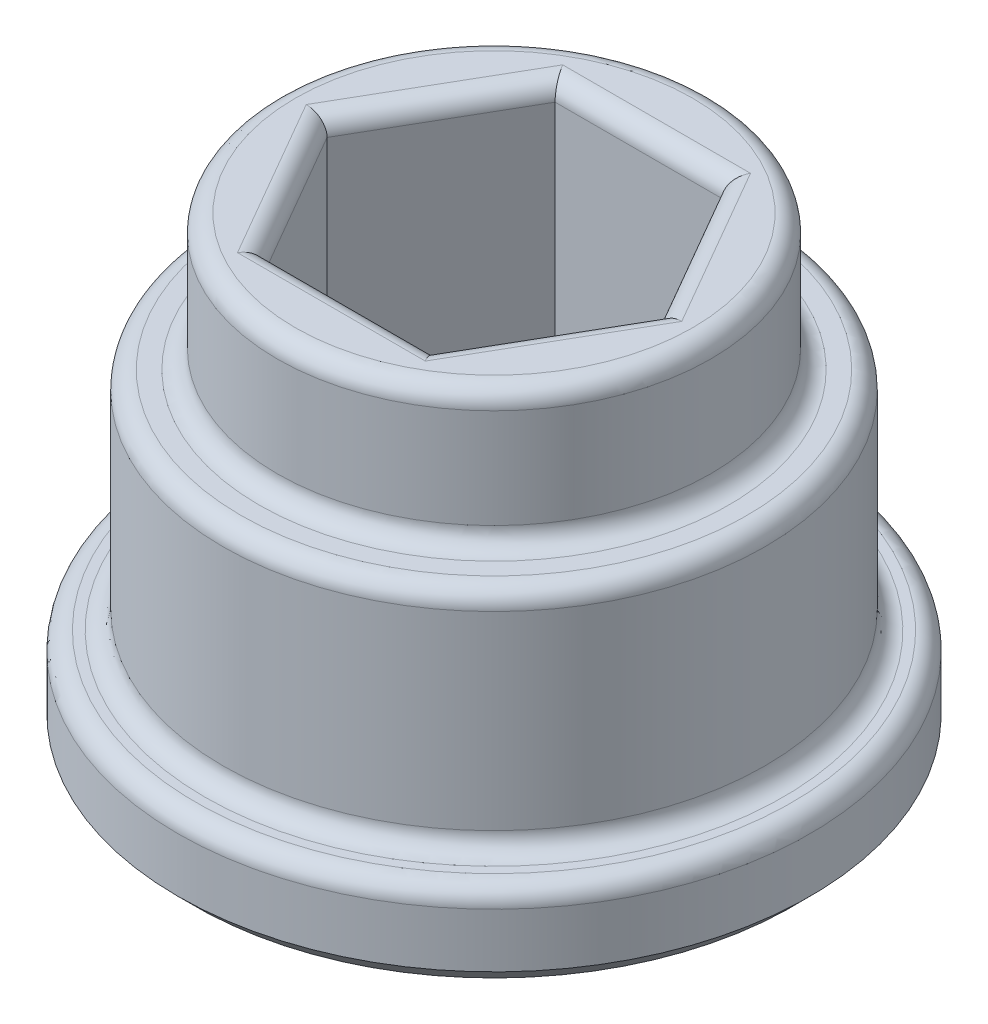
ISO-10303-21;
HEADER;
FILE_DESCRIPTION(('STEP AP214'),'2;1');
FILE_NAME('part.step','',(''),(''),'','','');
FILE_SCHEMA(('AUTOMOTIVE_DESIGN { 1 0 10303 214 1 1 1 1 }'));
ENDSEC;
DATA;
#1=APPLICATION_CONTEXT('core data for automotive mechanical design processes');
#2=APPLICATION_PROTOCOL_DEFINITION('international standard','automotive_design',2000,#1);
#3=PRODUCT_CONTEXT('',#1,'mechanical');
#4=PRODUCT('Part','Part','',(#3));
#5=PRODUCT_RELATED_PRODUCT_CATEGORY('part','',(#4));
#6=PRODUCT_DEFINITION_FORMATION('','',#4);
#7=PRODUCT_DEFINITION_CONTEXT('part definition',#1,'design');
#8=PRODUCT_DEFINITION('design','',#6,#7);
#9=PRODUCT_DEFINITION_SHAPE('','',#8);
#10=(LENGTH_UNIT() NAMED_UNIT(*) SI_UNIT(.MILLI.,.METRE.));
#11=(NAMED_UNIT(*) PLANE_ANGLE_UNIT() SI_UNIT($,.RADIAN.));
#12=(NAMED_UNIT(*) SI_UNIT($,.STERADIAN.) SOLID_ANGLE_UNIT());
#13=UNCERTAINTY_MEASURE_WITH_UNIT(LENGTH_MEASURE(1.E-05),#10,'distance_accuracy_value','');
#14=(GEOMETRIC_REPRESENTATION_CONTEXT(3) GLOBAL_UNCERTAINTY_ASSIGNED_CONTEXT((#13)) GLOBAL_UNIT_ASSIGNED_CONTEXT((#10,
#11,#12)) REPRESENTATION_CONTEXT('',''));
#15=CARTESIAN_POINT('',(0.,0.,0.));
#16=DIRECTION('',(0.,0.,1.));
#17=DIRECTION('',(1.,0.,0.));
#18=AXIS2_PLACEMENT_3D('',#15,#16,#17);
#19=CARTESIAN_POINT('',(0.,7.9375,0.));
#20=DIRECTION('',(0.,1.,0.));
#21=DIRECTION('',(0.,0.,1.));
#22=AXIS2_PLACEMENT_3D('',#19,#20,#21);
#23=PLANE('',#22);
#24=CARTESIAN_POINT('',(0.,7.9375,0.));
#25=DIRECTION('',(0.,1.,0.));
#26=DIRECTION('',(0.,0.,1.));
#27=AXIS2_PLACEMENT_3D('',#24,#25,#26);
#28=CIRCLE('',#27,8.255);
#29=CARTESIAN_POINT('',(0.,7.9375,8.255));
#30=VERTEX_POINT('',#29);
#31=EDGE_CURVE('E275',#30,#30,#28,.F.);
#32=ORIENTED_EDGE('',*,*,#31,.T.);
#33=EDGE_LOOP('',(#32));
#34=FACE_BOUND('',#33,.T.);
#35=CARTESIAN_POINT('',(0.,7.9375,0.));
#36=DIRECTION('',(0.,1.,0.));
#37=DIRECTION('',(0.,0.,1.));
#38=AXIS2_PLACEMENT_3D('',#35,#36,#37);
#39=CIRCLE('',#38,8.89);
#40=CARTESIAN_POINT('',(0.,7.9375,8.89));
#41=VERTEX_POINT('',#40);
#42=EDGE_CURVE('E271',#41,#41,#39,.T.);
#43=ORIENTED_EDGE('',*,*,#42,.T.);
#44=EDGE_LOOP('',(#43));
#45=FACE_BOUND('',#44,.T.);
#46=ADVANCED_FACE('F51',(#34,#45),#23,.T.);
#47=CARTESIAN_POINT('',(0.,7.9375,0.));
#48=DIRECTION('',(0.,-1.,0.));
#49=DIRECTION('',(0.,0.,-1.));
#50=AXIS2_PLACEMENT_3D('',#47,#48,#49);
#51=CYLINDRICAL_SURFACE('',#50,9.525);
#52=CARTESIAN_POINT('',(0.,7.3025,0.));
#53=DIRECTION('',(0.,1.,0.));
#54=DIRECTION('',(0.,0.,1.));
#55=AXIS2_PLACEMENT_3D('',#52,#53,#54);
#56=CIRCLE('',#55,9.525);
#57=CARTESIAN_POINT('',(0.,7.3025,9.525));
#58=VERTEX_POINT('',#57);
#59=EDGE_CURVE('E283',#58,#58,#56,.F.);
#60=ORIENTED_EDGE('',*,*,#59,.T.);
#61=EDGE_LOOP('',(#60));
#62=FACE_BOUND('',#61,.T.);
#63=CARTESIAN_POINT('',(0.,0.635,0.));
#64=DIRECTION('',(0.,-1.,0.));
#65=DIRECTION('',(0.,0.,-1.));
#66=AXIS2_PLACEMENT_3D('',#63,#64,#65);
#67=CIRCLE('',#66,9.525);
#68=CARTESIAN_POINT('',(0.,0.635,-9.525));
#69=VERTEX_POINT('',#68);
#70=EDGE_CURVE('E206',#69,#69,#67,.F.);
#71=ORIENTED_EDGE('',*,*,#70,.T.);
#72=EDGE_LOOP('',(#71));
#73=FACE_BOUND('',#72,.T.);
#74=ADVANCED_FACE('F401',(#62,#73),#51,.T.);
#75=CARTESIAN_POINT('',(2.9329393674833,7.9375,5.08));
#76=DIRECTION('',(-0.866025403784439,0.,-0.5));
#77=DIRECTION('',(-0.5,0.,0.866025403784439));
#78=AXIS2_PLACEMENT_3D('',#75,#76,#77);
#79=PLANE('',#78);
#80=DIRECTION('',(0.,-1.,0.));
#81=VECTOR('',#80,1.);
#82=CARTESIAN_POINT('',(5.8658787349666,7.9375,0.));
#83=LINE('',#82,#81);
#84=CARTESIAN_POINT('',(5.8658787349666,12.065,0.));
#85=VERTEX_POINT('',#84);
#86=CARTESIAN_POINT('',(5.8658787349666,-2.54,0.));
#87=VERTEX_POINT('',#86);
#88=EDGE_CURVE('E202',#85,#87,#83,.T.);
#89=ORIENTED_EDGE('',*,*,#88,.T.);
#90=DIRECTION('',(-0.5,0.,0.866025403784439));
#91=VECTOR('',#90,1.);
#92=CARTESIAN_POINT('',(2.9329393674833,-2.54,5.08));
#93=LINE('',#92,#91);
#94=CARTESIAN_POINT('',(2.9329393674833,-2.54,5.08));
#95=VERTEX_POINT('',#94);
#96=EDGE_CURVE('E313',#87,#95,#93,.T.);
#97=ORIENTED_EDGE('',*,*,#96,.T.);
#98=DIRECTION('',(0.,-1.,0.));
#99=VECTOR('',#98,1.);
#100=CARTESIAN_POINT('',(2.9329393674833,7.9375,5.08));
#101=LINE('',#100,#99);
#102=CARTESIAN_POINT('',(2.9329393674833,12.065,5.08));
#103=VERTEX_POINT('',#102);
#104=EDGE_CURVE('E184',#103,#95,#101,.T.);
#105=ORIENTED_EDGE('',*,*,#104,.F.);
#106=DIRECTION('',(0.5,0.,-0.866025403784439));
#107=VECTOR('',#106,1.);
#108=CARTESIAN_POINT('',(2.9329393674833,12.065,5.08));
#109=LINE('',#108,#107);
#110=EDGE_CURVE('E170',#103,#85,#109,.T.);
#111=ORIENTED_EDGE('',*,*,#110,.T.);
#112=EDGE_LOOP('',(#89,#97,#105,#111));
#113=FACE_BOUND('',#112,.T.);
#114=ADVANCED_FACE('F406',(#113),#79,.T.);
#115=CARTESIAN_POINT('',(5.8658787349666,7.9375,0.));
#116=DIRECTION('',(-0.866025403784438,0.,0.5));
#117=DIRECTION('',(0.5,0.,0.866025403784438));
#118=AXIS2_PLACEMENT_3D('',#115,#116,#117);
#119=PLANE('',#118);
#120=DIRECTION('',(0.,-1.,0.));
#121=VECTOR('',#120,1.);
#122=CARTESIAN_POINT('',(2.9329393674833,7.9375,-5.08));
#123=LINE('',#122,#121);
#124=CARTESIAN_POINT('',(2.9329393674833,12.065,-5.08));
#125=VERTEX_POINT('',#124);
#126=CARTESIAN_POINT('',(2.9329393674833,-2.54,-5.08));
#127=VERTEX_POINT('',#126);
#128=EDGE_CURVE('E198',#125,#127,#123,.T.);
#129=ORIENTED_EDGE('',*,*,#128,.T.);
#130=DIRECTION('',(0.5,0.,0.866025403784438));
#131=VECTOR('',#130,1.);
#132=CARTESIAN_POINT('',(5.8658787349666,-2.54,0.));
#133=LINE('',#132,#131);
#134=EDGE_CURVE('E287',#127,#87,#133,.T.);
#135=ORIENTED_EDGE('',*,*,#134,.T.);
#136=ORIENTED_EDGE('',*,*,#88,.F.);
#137=DIRECTION('',(-0.5,0.,-0.866025403784438));
#138=VECTOR('',#137,1.);
#139=CARTESIAN_POINT('',(5.8658787349666,12.065,0.));
#140=LINE('',#139,#138);
#141=EDGE_CURVE('E239',#85,#125,#140,.T.);
#142=ORIENTED_EDGE('',*,*,#141,.T.);
#143=EDGE_LOOP('',(#129,#135,#136,#142));
#144=FACE_BOUND('',#143,.T.);
#145=ADVANCED_FACE('F370',(#144),#119,.T.);
#146=CARTESIAN_POINT('',(2.9329393674833,7.9375,-5.08));
#147=DIRECTION('',(0.,0.,1.));
#148=DIRECTION('',(1.,0.,0.));
#149=AXIS2_PLACEMENT_3D('',#146,#147,#148);
#150=PLANE('',#149);
#151=DIRECTION('',(0.,-1.,0.));
#152=VECTOR('',#151,1.);
#153=CARTESIAN_POINT('',(-2.9329393674833,7.9375,-5.08));
#154=LINE('',#153,#152);
#155=CARTESIAN_POINT('',(-2.9329393674833,12.065,-5.08));
#156=VERTEX_POINT('',#155);
#157=CARTESIAN_POINT('',(-2.9329393674833,-2.54,-5.08));
#158=VERTEX_POINT('',#157);
#159=EDGE_CURVE('E190',#156,#158,#154,.T.);
#160=ORIENTED_EDGE('',*,*,#159,.T.);
#161=DIRECTION('',(1.,0.,0.));
#162=VECTOR('',#161,1.);
#163=CARTESIAN_POINT('',(2.9329393674833,-2.54,-5.08));
#164=LINE('',#163,#162);
#165=EDGE_CURVE('E62',#158,#127,#164,.T.);
#166=ORIENTED_EDGE('',*,*,#165,.T.);
#167=ORIENTED_EDGE('',*,*,#128,.F.);
#168=DIRECTION('',(-1.,0.,0.));
#169=VECTOR('',#168,1.);
#170=CARTESIAN_POINT('',(2.9329393674833,12.065,-5.08));
#171=LINE('',#170,#169);
#172=EDGE_CURVE('E242',#125,#156,#171,.T.);
#173=ORIENTED_EDGE('',*,*,#172,.T.);
#174=EDGE_LOOP('',(#160,#166,#167,#173));
#175=FACE_BOUND('',#174,.T.);
#176=ADVANCED_FACE('F367',(#175),#150,.T.);
#177=CARTESIAN_POINT('',(-2.9329393674833,7.9375,-5.08));
#178=DIRECTION('',(0.866025403784438,0.,0.5));
#179=DIRECTION('',(0.5,0.,-0.866025403784439));
#180=AXIS2_PLACEMENT_3D('',#177,#178,#179);
#181=PLANE('',#180);
#182=DIRECTION('',(0.,-1.,0.));
#183=VECTOR('',#182,1.);
#184=CARTESIAN_POINT('',(-5.8658787349666,7.9375,0.));
#185=LINE('',#184,#183);
#186=CARTESIAN_POINT('',(-5.8658787349666,12.065,0.));
#187=VERTEX_POINT('',#186);
#188=CARTESIAN_POINT('',(-5.8658787349666,-2.54,0.));
#189=VERTEX_POINT('',#188);
#190=EDGE_CURVE('E174',#187,#189,#185,.T.);
#191=ORIENTED_EDGE('',*,*,#190,.T.);
#192=DIRECTION('',(0.5,0.,-0.866025403784439));
#193=VECTOR('',#192,1.);
#194=CARTESIAN_POINT('',(-2.9329393674833,-2.54,-5.08));
#195=LINE('',#194,#193);
#196=EDGE_CURVE('E70',#189,#158,#195,.T.);
#197=ORIENTED_EDGE('',*,*,#196,.T.);
#198=ORIENTED_EDGE('',*,*,#159,.F.);
#199=DIRECTION('',(-0.5,0.,0.866025403784439));
#200=VECTOR('',#199,1.);
#201=CARTESIAN_POINT('',(-2.9329393674833,12.065,-5.08));
#202=LINE('',#201,#200);
#203=EDGE_CURVE('E245',#156,#187,#202,.T.);
#204=ORIENTED_EDGE('',*,*,#203,.T.);
#205=EDGE_LOOP('',(#191,#197,#198,#204));
#206=FACE_BOUND('',#205,.T.);
#207=ADVANCED_FACE('F389',(#206),#181,.T.);
#208=CARTESIAN_POINT('',(-5.8658787349666,7.9375,0.));
#209=DIRECTION('',(0.866025403784438,0.,-0.5));
#210=DIRECTION('',(-0.5,0.,-0.866025403784439));
#211=AXIS2_PLACEMENT_3D('',#208,#209,#210);
#212=PLANE('',#211);
#213=DIRECTION('',(0.,-1.,0.));
#214=VECTOR('',#213,1.);
#215=CARTESIAN_POINT('',(-2.9329393674833,7.9375,5.08));
#216=LINE('',#215,#214);
#217=CARTESIAN_POINT('',(-2.9329393674833,12.065,5.08));
#218=VERTEX_POINT('',#217);
#219=CARTESIAN_POINT('',(-2.9329393674833,-2.54,5.08));
#220=VERTEX_POINT('',#219);
#221=EDGE_CURVE('E173',#218,#220,#216,.T.);
#222=ORIENTED_EDGE('',*,*,#221,.T.);
#223=DIRECTION('',(-0.5,0.,-0.866025403784439));
#224=VECTOR('',#223,1.);
#225=CARTESIAN_POINT('',(-5.8658787349666,-2.54,0.));
#226=LINE('',#225,#224);
#227=EDGE_CURVE('E78',#220,#189,#226,.T.);
#228=ORIENTED_EDGE('',*,*,#227,.T.);
#229=ORIENTED_EDGE('',*,*,#190,.F.);
#230=DIRECTION('',(0.5,0.,0.866025403784439));
#231=VECTOR('',#230,1.);
#232=CARTESIAN_POINT('',(-5.8658787349666,12.065,0.));
#233=LINE('',#232,#231);
#234=EDGE_CURVE('E152',#187,#218,#233,.T.);
#235=ORIENTED_EDGE('',*,*,#234,.T.);
#236=EDGE_LOOP('',(#222,#228,#229,#235));
#237=FACE_BOUND('',#236,.T.);
#238=ADVANCED_FACE('F172',(#237),#212,.T.);
#239=CARTESIAN_POINT('',(-2.9329393674833,7.9375,5.08));
#240=DIRECTION('',(0.,0.,-1.));
#241=DIRECTION('',(-1.,0.,0.));
#242=AXIS2_PLACEMENT_3D('',#239,#240,#241);
#243=PLANE('',#242);
#244=ORIENTED_EDGE('',*,*,#104,.T.);
#245=DIRECTION('',(-1.,0.,0.));
#246=VECTOR('',#245,1.);
#247=CARTESIAN_POINT('',(-2.9329393674833,-2.54,5.08));
#248=LINE('',#247,#246);
#249=EDGE_CURVE('E182',#95,#220,#248,.T.);
#250=ORIENTED_EDGE('',*,*,#249,.T.);
#251=ORIENTED_EDGE('',*,*,#221,.F.);
#252=DIRECTION('',(1.,0.,0.));
#253=VECTOR('',#252,1.);
#254=CARTESIAN_POINT('',(-2.9329393674833,12.065,5.08));
#255=LINE('',#254,#253);
#256=EDGE_CURVE('E161',#218,#103,#255,.T.);
#257=ORIENTED_EDGE('',*,*,#256,.T.);
#258=EDGE_LOOP('',(#244,#250,#251,#257));
#259=FACE_BOUND('',#258,.T.);
#260=ADVANCED_FACE('F180',(#259),#243,.T.);
#261=CARTESIAN_POINT('',(0.,12.7,0.));
#262=DIRECTION('',(0.,1.,0.));
#263=DIRECTION('',(0.,0.,1.));
#264=AXIS2_PLACEMENT_3D('',#261,#262,#263);
#265=PLANE('',#264);
#266=CARTESIAN_POINT('',(0.,12.7,0.));
#267=DIRECTION('',(0.,1.,0.));
#268=DIRECTION('',(0.,0.,1.));
#269=AXIS2_PLACEMENT_3D('',#266,#267,#268);
#270=CIRCLE('',#269,6.985);
#271=CARTESIAN_POINT('',(0.,12.7,6.985));
#272=VERTEX_POINT('',#271);
#273=EDGE_CURVE('E279',#272,#272,#270,.T.);
#274=ORIENTED_EDGE('',*,*,#273,.T.);
#275=EDGE_LOOP('',(#274));
#276=FACE_BOUND('',#275,.T.);
#277=DIRECTION('',(1.,0.,0.));
#278=VECTOR('',#277,1.);
#279=CARTESIAN_POINT('',(0.,12.7,5.715));
#280=LINE('',#279,#278);
#281=CARTESIAN_POINT('',(3.29955678841871,12.7,5.715));
#282=VERTEX_POINT('',#281);
#283=CARTESIAN_POINT('',(-3.29955678841871,12.7,5.715));
#284=VERTEX_POINT('',#283);
#285=EDGE_CURVE('E232',#282,#284,#280,.F.);
#286=ORIENTED_EDGE('',*,*,#285,.T.);
#287=DIRECTION('',(0.5,0.,0.866025403784439));
#288=VECTOR('',#287,1.);
#289=CARTESIAN_POINT('',(-4.94933518262807,12.7,2.8575));
#290=LINE('',#289,#288);
#291=CARTESIAN_POINT('',(-6.59911357683742,12.7,0.));
#292=VERTEX_POINT('',#291);
#293=EDGE_CURVE('E154',#284,#292,#290,.F.);
#294=ORIENTED_EDGE('',*,*,#293,.T.);
#295=DIRECTION('',(-0.5,0.,0.866025403784439));
#296=VECTOR('',#295,1.);
#297=CARTESIAN_POINT('',(-4.94933518262807,12.7,-2.8575));
#298=LINE('',#297,#296);
#299=CARTESIAN_POINT('',(-3.29955678841871,12.7,-5.715));
#300=VERTEX_POINT('',#299);
#301=EDGE_CURVE('E177',#292,#300,#298,.F.);
#302=ORIENTED_EDGE('',*,*,#301,.T.);
#303=DIRECTION('',(-1.,0.,0.));
#304=VECTOR('',#303,1.);
#305=CARTESIAN_POINT('',(0.,12.7,-5.715));
#306=LINE('',#305,#304);
#307=CARTESIAN_POINT('',(3.29955678841871,12.7,-5.715));
#308=VERTEX_POINT('',#307);
#309=EDGE_CURVE('E223',#300,#308,#306,.F.);
#310=ORIENTED_EDGE('',*,*,#309,.T.);
#311=DIRECTION('',(-0.5,0.,-0.866025403784438));
#312=VECTOR('',#311,1.);
#313=CARTESIAN_POINT('',(4.94933518262807,12.7,-2.8575));
#314=LINE('',#313,#312);
#315=CARTESIAN_POINT('',(6.59911357683742,12.7,0.));
#316=VERTEX_POINT('',#315);
#317=EDGE_CURVE('E226',#308,#316,#314,.F.);
#318=ORIENTED_EDGE('',*,*,#317,.T.);
#319=DIRECTION('',(0.5,0.,-0.866025403784439));
#320=VECTOR('',#319,1.);
#321=CARTESIAN_POINT('',(4.94933518262807,12.7,2.8575));
#322=LINE('',#321,#320);
#323=EDGE_CURVE('E229',#316,#282,#322,.F.);
#324=ORIENTED_EDGE('',*,*,#323,.T.);
#325=EDGE_LOOP('',(#286,#294,#302,#310,#318,#324));
#326=FACE_BOUND('',#325,.T.);
#327=ADVANCED_FACE('F383',(#276,#326),#265,.T.);
#328=CARTESIAN_POINT('',(0.,12.7,0.));
#329=DIRECTION('',(0.,-1.,0.));
#330=DIRECTION('',(0.,0.,-1.));
#331=AXIS2_PLACEMENT_3D('',#328,#329,#330);
#332=CYLINDRICAL_SURFACE('',#331,7.62);
#333=CARTESIAN_POINT('',(0.,8.5725,0.));
#334=DIRECTION('',(0.,1.,0.));
#335=DIRECTION('',(0.,0.,1.));
#336=AXIS2_PLACEMENT_3D('',#333,#334,#335);
#337=CIRCLE('',#336,7.62);
#338=CARTESIAN_POINT('',(0.,8.5725,-7.62));
#339=VERTEX_POINT('',#338);
#340=EDGE_CURVE('E267',#339,#339,#337,.T.);
#341=CARTESIAN_POINT('',(0.,12.065,0.));
#342=DIRECTION('',(0.,1.,0.));
#343=DIRECTION('',(0.,0.,1.));
#344=AXIS2_PLACEMENT_3D('',#341,#342,#343);
#345=CIRCLE('',#344,7.62);
#346=CARTESIAN_POINT('',(0.,12.065,-7.62));
#347=VERTEX_POINT('',#346);
#348=EDGE_CURVE('E247',#347,#347,#345,.F.);
#349=CARTESIAN_POINT('',(0.,8.5725,-7.62));
#350=CARTESIAN_POINT('',(0.,8.60888020833333,-7.62));
#351=CARTESIAN_POINT('',(0.,8.64526041666667,-7.62));
#352=CARTESIAN_POINT('',(0.,8.71802083333333,-7.62));
#353=CARTESIAN_POINT('',(0.,8.75440104166667,-7.62));
#354=CARTESIAN_POINT('',(0.,8.82716145833333,-7.62));
#355=CARTESIAN_POINT('',(0.,8.86354166666666,-7.62));
#356=CARTESIAN_POINT('',(0.,8.93630208333333,-7.62));
#357=CARTESIAN_POINT('',(0.,8.97268229166666,-7.62));
#358=CARTESIAN_POINT('',(0.,9.04544270833333,-7.62));
#359=CARTESIAN_POINT('',(0.,9.08182291666667,-7.62));
#360=CARTESIAN_POINT('',(0.,9.15458333333333,-7.62));
#361=CARTESIAN_POINT('',(0.,9.19096354166667,-7.62));
#362=CARTESIAN_POINT('',(0.,9.26372395833333,-7.62));
#363=CARTESIAN_POINT('',(0.,9.30010416666667,-7.62));
#364=CARTESIAN_POINT('',(0.,9.37286458333333,-7.62));
#365=CARTESIAN_POINT('',(0.,9.40924479166667,-7.62));
#366=CARTESIAN_POINT('',(0.,9.48200520833333,-7.62));
#367=CARTESIAN_POINT('',(0.,9.51838541666667,-7.62));
#368=CARTESIAN_POINT('',(0.,9.59114583333333,-7.62));
#369=CARTESIAN_POINT('',(0.,9.62752604166667,-7.62));
#370=CARTESIAN_POINT('',(0.,9.70028645833333,-7.62));
#371=CARTESIAN_POINT('',(0.,9.73666666666667,-7.62));
#372=CARTESIAN_POINT('',(0.,9.80942708333333,-7.62));
#373=CARTESIAN_POINT('',(0.,9.84580729166666,-7.62));
#374=CARTESIAN_POINT('',(0.,9.91856770833333,-7.62));
#375=CARTESIAN_POINT('',(0.,9.95494791666667,-7.62));
#376=CARTESIAN_POINT('',(0.,10.0277083333333,-7.62));
#377=CARTESIAN_POINT('',(0.,10.0640885416667,-7.62));
#378=CARTESIAN_POINT('',(0.,10.1368489583333,-7.62));
#379=CARTESIAN_POINT('',(0.,10.1732291666667,-7.62));
#380=CARTESIAN_POINT('',(0.,10.2459895833333,-7.62));
#381=CARTESIAN_POINT('',(0.,10.2823697916667,-7.62));
#382=CARTESIAN_POINT('',(0.,10.3551302083333,-7.62));
#383=CARTESIAN_POINT('',(0.,10.3915104166667,-7.62));
#384=CARTESIAN_POINT('',(0.,10.4642708333333,-7.62));
#385=CARTESIAN_POINT('',(0.,10.5006510416667,-7.62));
#386=CARTESIAN_POINT('',(0.,10.5734114583333,-7.62));
#387=CARTESIAN_POINT('',(0.,10.6097916666667,-7.62));
#388=CARTESIAN_POINT('',(0.,10.6825520833333,-7.62));
#389=CARTESIAN_POINT('',(0.,10.7189322916667,-7.62));
#390=CARTESIAN_POINT('',(0.,10.7916927083333,-7.62));
#391=CARTESIAN_POINT('',(0.,10.8280729166667,-7.62));
#392=CARTESIAN_POINT('',(0.,10.9008333333333,-7.62));
#393=CARTESIAN_POINT('',(0.,10.9372135416667,-7.62));
#394=CARTESIAN_POINT('',(0.,11.0099739583333,-7.62));
#395=CARTESIAN_POINT('',(0.,11.0463541666667,-7.62));
#396=CARTESIAN_POINT('',(0.,11.1191145833333,-7.62));
#397=CARTESIAN_POINT('',(0.,11.1554947916667,-7.62));
#398=CARTESIAN_POINT('',(0.,11.2282552083333,-7.62));
#399=CARTESIAN_POINT('',(0.,11.2646354166667,-7.62));
#400=CARTESIAN_POINT('',(0.,11.3373958333333,-7.62));
#401=CARTESIAN_POINT('',(0.,11.3737760416667,-7.62));
#402=CARTESIAN_POINT('',(0.,11.4465364583333,-7.62));
#403=CARTESIAN_POINT('',(0.,11.4829166666667,-7.62));
#404=CARTESIAN_POINT('',(0.,11.5556770833333,-7.62));
#405=CARTESIAN_POINT('',(0.,11.5920572916667,-7.62));
#406=CARTESIAN_POINT('',(0.,11.6648177083333,-7.62));
#407=CARTESIAN_POINT('',(0.,11.7011979166667,-7.62));
#408=CARTESIAN_POINT('',(0.,11.7739583333333,-7.62));
#409=CARTESIAN_POINT('',(0.,11.8103385416667,-7.62));
#410=CARTESIAN_POINT('',(0.,11.8830989583333,-7.62));
#411=CARTESIAN_POINT('',(0.,11.9194791666667,-7.62));
#412=CARTESIAN_POINT('',(0.,11.9922395833333,-7.62));
#413=CARTESIAN_POINT('',(0.,12.0286197916667,-7.62));
#414=CARTESIAN_POINT('',(0.,12.065,-7.62));
#415=B_SPLINE_CURVE_WITH_KNOTS('',3,(#349,#350,#351,#352,#353,#354,#355,#356,#357,#358,#359,
#360,#361,#362,#363,#364,#365,#366,#367,#368,#369,#370,#371,#372,#373,#374,#375,#376,#377,#378,
#379,#380,#381,#382,#383,#384,#385,#386,#387,#388,#389,#390,#391,#392,#393,#394,#395,#396,#397,
#398,#399,#400,#401,#402,#403,#404,#405,#406,#407,#408,#409,#410,#411,#412,#413,#414),
.UNSPECIFIED.,.F.,.F.,(4,2,2,2,2,2,2,2,2,2,2,2,2,2,2,2,2,2,2,2,2,2,2,2,2,2,2,2,2,2,2,2,4),(0.,
0.109140625,0.218281249999999,0.327421874999999,0.436562499999998,0.545703124999998,
0.654843749999998,0.763984374999999,0.873124999999999,0.982265624999999,1.09140625,1.200546875,
1.3096875,1.418828125,1.52796875,1.637109375,1.74625,1.855390625,1.96453125,2.073671875,
2.1828125,2.291953125,2.40109375,2.510234375,2.619375,2.728515625,2.83765625,2.946796875,
3.0559375,3.165078125,3.27421875,3.383359375,3.4925),.UNSPECIFIED.);
#416=EDGE_CURVE('BSEAM632',#339,#347,#415,.T.);
#417=ORIENTED_EDGE('',*,*,#340,.T.);
#418=ORIENTED_EDGE('',*,*,#348,.T.);
#419=ORIENTED_EDGE('',*,*,#416,.T.);
#420=ORIENTED_EDGE('',*,*,#416,.F.);
#421=EDGE_LOOP('',(#417,#419,#418,#420));
#422=FACE_BOUND('',#421,.T.);
#423=ADVANCED_FACE('F632',(#422),#332,.T.);
#424=CARTESIAN_POINT('',(0.,-3.175,0.));
#425=DIRECTION('',(0.,-1.,0.));
#426=DIRECTION('',(0.,0.,-1.));
#427=AXIS2_PLACEMENT_3D('',#424,#425,#426);
#428=PLANE('',#427);
#429=DIRECTION('',(0.5,0.,-0.866025403784439));
#430=VECTOR('',#429,1.);
#431=CARTESIAN_POINT('',(4.94933518262807,-3.175,2.8575));
#432=LINE('',#431,#430);
#433=CARTESIAN_POINT('',(3.29955678841872,-3.175,5.715));
#434=VERTEX_POINT('',#433);
#435=CARTESIAN_POINT('',(6.59911357683743,-3.175,0.));
#436=VERTEX_POINT('',#435);
#437=EDGE_CURVE('E306',#434,#436,#432,.T.);
#438=ORIENTED_EDGE('',*,*,#437,.T.);
#439=DIRECTION('',(-0.5,0.,-0.866025403784439));
#440=VECTOR('',#439,1.);
#441=CARTESIAN_POINT('',(4.94933518262807,-3.175,-2.8575));
#442=LINE('',#441,#440);
#443=CARTESIAN_POINT('',(3.29955678841871,-3.175,-5.71500000000001));
#444=VERTEX_POINT('',#443);
#445=EDGE_CURVE('E309',#436,#444,#442,.T.);
#446=ORIENTED_EDGE('',*,*,#445,.T.);
#447=DIRECTION('',(-1.,0.,0.));
#448=VECTOR('',#447,1.);
#449=CARTESIAN_POINT('',(0.,-3.175,-5.71500000000001));
#450=LINE('',#449,#448);
#451=CARTESIAN_POINT('',(-3.29955678841871,-3.175,-5.71500000000001));
#452=VERTEX_POINT('',#451);
#453=EDGE_CURVE('E295',#444,#452,#450,.T.);
#454=ORIENTED_EDGE('',*,*,#453,.T.);
#455=DIRECTION('',(-0.5,0.,0.866025403784439));
#456=VECTOR('',#455,1.);
#457=CARTESIAN_POINT('',(-4.94933518262807,-3.175,-2.8575));
#458=LINE('',#457,#456);
#459=CARTESIAN_POINT('',(-6.59911357683743,-3.175,0.));
#460=VERTEX_POINT('',#459);
#461=EDGE_CURVE('E298',#452,#460,#458,.T.);
#462=ORIENTED_EDGE('',*,*,#461,.T.);
#463=DIRECTION('',(0.5,0.,0.866025403784439));
#464=VECTOR('',#463,1.);
#465=CARTESIAN_POINT('',(-4.94933518262807,-3.175,2.8575));
#466=LINE('',#465,#464);
#467=CARTESIAN_POINT('',(-3.29955678841871,-3.175,5.715));
#468=VERTEX_POINT('',#467);
#469=EDGE_CURVE('E301',#460,#468,#466,.T.);
#470=ORIENTED_EDGE('',*,*,#469,.T.);
#471=DIRECTION('',(1.,0.,0.));
#472=VECTOR('',#471,1.);
#473=CARTESIAN_POINT('',(0.,-3.175,5.715));
#474=LINE('',#473,#472);
#475=EDGE_CURVE('E303',#468,#434,#474,.T.);
#476=ORIENTED_EDGE('',*,*,#475,.T.);
#477=EDGE_LOOP('',(#438,#446,#454,#462,#470,#476));
#478=FACE_BOUND('',#477,.T.);
#479=CARTESIAN_POINT('',(0.,-3.175,0.));
#480=DIRECTION('',(0.,-1.,0.));
#481=DIRECTION('',(0.,0.,-1.));
#482=AXIS2_PLACEMENT_3D('',#479,#480,#481);
#483=CIRCLE('',#482,10.4775);
#484=CARTESIAN_POINT('',(0.,-3.175,-10.4775));
#485=VERTEX_POINT('',#484);
#486=EDGE_CURVE('E291',#485,#485,#483,.T.);
#487=ORIENTED_EDGE('',*,*,#486,.T.);
#488=EDGE_LOOP('',(#487));
#489=FACE_BOUND('',#488,.T.);
#490=ADVANCED_FACE('F355',(#478,#489),#428,.T.);
#491=CARTESIAN_POINT('',(0.,0.,0.));
#492=DIRECTION('',(0.,-1.,0.));
#493=DIRECTION('',(0.,0.,-1.));
#494=AXIS2_PLACEMENT_3D('',#491,#492,#493);
#495=PLANE('',#494);
#496=CARTESIAN_POINT('',(0.,0.,0.));
#497=DIRECTION('',(0.,-1.,0.));
#498=DIRECTION('',(0.,0.,-1.));
#499=AXIS2_PLACEMENT_3D('',#496,#497,#498);
#500=CIRCLE('',#499,10.16);
#501=CARTESIAN_POINT('',(0.,0.,-10.16));
#502=VERTEX_POINT('',#501);
#503=EDGE_CURVE('E214',#502,#502,#500,.T.);
#504=ORIENTED_EDGE('',*,*,#503,.T.);
#505=EDGE_LOOP('',(#504));
#506=FACE_BOUND('',#505,.T.);
#507=CARTESIAN_POINT('',(0.,0.,0.));
#508=DIRECTION('',(0.,-1.,0.));
#509=DIRECTION('',(0.,0.,-1.));
#510=AXIS2_PLACEMENT_3D('',#507,#508,#509);
#511=CIRCLE('',#510,10.4775);
#512=CARTESIAN_POINT('',(0.,0.,-10.4775));
#513=VERTEX_POINT('',#512);
#514=EDGE_CURVE('E210',#513,#513,#511,.F.);
#515=ORIENTED_EDGE('',*,*,#514,.T.);
#516=EDGE_LOOP('',(#515));
#517=FACE_BOUND('',#516,.T.);
#518=ADVANCED_FACE('F612',(#506,#517),#495,.F.);
#519=CARTESIAN_POINT('',(0.,-3.175,0.));
#520=DIRECTION('',(0.,1.,0.));
#521=DIRECTION('',(0.,0.,1.));
#522=AXIS2_PLACEMENT_3D('',#519,#520,#521);
#523=CYLINDRICAL_SURFACE('',#522,11.1125);
#524=CARTESIAN_POINT('',(0.,-2.54,0.));
#525=DIRECTION('',(0.,-1.,0.));
#526=DIRECTION('',(0.,0.,-1.));
#527=AXIS2_PLACEMENT_3D('',#524,#525,#526);
#528=CIRCLE('',#527,11.1125);
#529=CARTESIAN_POINT('',(0.,-2.54,-11.1125));
#530=VERTEX_POINT('',#529);
#531=EDGE_CURVE('E11',#530,#530,#528,.F.);
#532=ORIENTED_EDGE('',*,*,#531,.T.);
#533=EDGE_LOOP('',(#532));
#534=FACE_BOUND('',#533,.T.);
#535=CARTESIAN_POINT('',(0.,-0.635,0.));
#536=DIRECTION('',(0.,-1.,0.));
#537=DIRECTION('',(0.,0.,-1.));
#538=AXIS2_PLACEMENT_3D('',#535,#536,#537);
#539=CIRCLE('',#538,11.1125);
#540=CARTESIAN_POINT('',(0.,-0.635,-11.1125));
#541=VERTEX_POINT('',#540);
#542=EDGE_CURVE('E178',#541,#541,#539,.T.);
#543=ORIENTED_EDGE('',*,*,#542,.T.);
#544=EDGE_LOOP('',(#543));
#545=FACE_BOUND('',#544,.T.);
#546=ADVANCED_FACE('F417',(#534,#545),#523,.T.);
#547=CARTESIAN_POINT('',(0.,0.635,0.));
#548=DIRECTION('',(0.,-1.,0.));
#549=DIRECTION('',(0.,0.,-1.));
#550=AXIS2_PLACEMENT_3D('',#547,#548,#549);
#551=TOROIDAL_SURFACE('',#550,10.16,0.635);
#552=ORIENTED_EDGE('',*,*,#503,.F.);
#553=EDGE_LOOP('',(#552));
#554=FACE_BOUND('',#553,.T.);
#555=ORIENTED_EDGE('',*,*,#70,.F.);
#556=EDGE_LOOP('',(#555));
#557=FACE_BOUND('',#556,.T.);
#558=ADVANCED_FACE('F413',(#554,#557),#551,.F.);
#559=CARTESIAN_POINT('',(0.,-0.635,0.));
#560=DIRECTION('',(0.,-1.,0.));
#561=DIRECTION('',(0.,0.,-1.));
#562=AXIS2_PLACEMENT_3D('',#559,#560,#561);
#563=TOROIDAL_SURFACE('',#562,10.4775,0.635);
#564=ORIENTED_EDGE('',*,*,#514,.F.);
#565=EDGE_LOOP('',(#564));
#566=FACE_BOUND('',#565,.T.);
#567=ORIENTED_EDGE('',*,*,#542,.F.);
#568=EDGE_LOOP('',(#567));
#569=FACE_BOUND('',#568,.T.);
#570=ADVANCED_FACE('F416',(#566,#569),#563,.T.);
#571=CARTESIAN_POINT('',(6.41580486636972,12.065,-0.3175));
#572=DIRECTION('',(-0.5,0.,-0.866025403784438));
#573=DIRECTION('',(-0.866025403784438,0.,0.5));
#574=AXIS2_PLACEMENT_3D('',#571,#572,#573);
#575=CYLINDRICAL_SURFACE('',#574,0.635);
#576=CARTESIAN_POINT('',(6.59911357683742,12.065,0.));
#577=DIRECTION('',(0.,0.,-1.));
#578=DIRECTION('',(1.,0.,0.));
#579=AXIS2_PLACEMENT_3D('',#576,#577,#578);
#580=ELLIPSE('',#579,0.733234841870825,0.635);
#581=EDGE_CURVE('E257',#316,#85,#580,.F.);
#582=ORIENTED_EDGE('',*,*,#581,.F.);
#583=ORIENTED_EDGE('',*,*,#317,.F.);
#584=CARTESIAN_POINT('',(3.29955678841871,12.065,-5.715));
#585=DIRECTION('',(-0.866025403784439,0.,-0.5));
#586=DIRECTION('',(0.5,0.,-0.866025403784439));
#587=AXIS2_PLACEMENT_3D('',#584,#585,#586);
#588=ELLIPSE('',#587,0.733234841870825,0.635);
#589=EDGE_CURVE('E193',#125,#308,#588,.T.);
#590=ORIENTED_EDGE('',*,*,#589,.F.);
#591=ORIENTED_EDGE('',*,*,#141,.F.);
#592=EDGE_LOOP('',(#582,#583,#590,#591));
#593=FACE_BOUND('',#592,.T.);
#594=ADVANCED_FACE('F375',(#593),#575,.T.);
#595=CARTESIAN_POINT('',(2.9329393674833,12.065,-5.715));
#596=DIRECTION('',(-1.,0.,0.));
#597=DIRECTION('',(0.,0.,1.));
#598=AXIS2_PLACEMENT_3D('',#595,#596,#597);
#599=CYLINDRICAL_SURFACE('',#598,0.635);
#600=ORIENTED_EDGE('',*,*,#589,.T.);
#601=ORIENTED_EDGE('',*,*,#309,.F.);
#602=CARTESIAN_POINT('',(-3.29955678841871,12.065,-5.715));
#603=DIRECTION('',(-0.866025403784439,0.,0.5));
#604=DIRECTION('',(-0.5,0.,-0.866025403784439));
#605=AXIS2_PLACEMENT_3D('',#602,#603,#604);
#606=ELLIPSE('',#605,0.733234841870825,0.635);
#607=EDGE_CURVE('E253',#156,#300,#606,.T.);
#608=ORIENTED_EDGE('',*,*,#607,.F.);
#609=ORIENTED_EDGE('',*,*,#172,.F.);
#610=EDGE_LOOP('',(#600,#601,#608,#609));
#611=FACE_BOUND('',#610,.T.);
#612=ADVANCED_FACE('F386',(#611),#599,.T.);
#613=CARTESIAN_POINT('',(3.48286549888642,12.065,5.3975));
#614=DIRECTION('',(0.5,0.,-0.866025403784439));
#615=DIRECTION('',(-0.866025403784439,0.,-0.5));
#616=AXIS2_PLACEMENT_3D('',#613,#614,#615);
#617=CYLINDRICAL_SURFACE('',#616,0.635);
#618=ORIENTED_EDGE('',*,*,#581,.T.);
#619=ORIENTED_EDGE('',*,*,#110,.F.);
#620=CARTESIAN_POINT('',(3.29955678841871,12.065,5.715));
#621=DIRECTION('',(0.866025403784439,0.,-0.5));
#622=DIRECTION('',(0.5,0.,0.866025403784439));
#623=AXIS2_PLACEMENT_3D('',#620,#621,#622);
#624=ELLIPSE('',#623,0.733234841870825,0.635);
#625=EDGE_CURVE('E164',#282,#103,#624,.F.);
#626=ORIENTED_EDGE('',*,*,#625,.F.);
#627=ORIENTED_EDGE('',*,*,#323,.F.);
#628=EDGE_LOOP('',(#618,#619,#626,#627));
#629=FACE_BOUND('',#628,.T.);
#630=ADVANCED_FACE('F381',(#629),#617,.T.);
#631=CARTESIAN_POINT('',(-3.48286549888642,12.065,-5.3975));
#632=DIRECTION('',(-0.5,0.,0.866025403784439));
#633=DIRECTION('',(0.866025403784438,0.,0.5));
#634=AXIS2_PLACEMENT_3D('',#631,#632,#633);
#635=CYLINDRICAL_SURFACE('',#634,0.635);
#636=ORIENTED_EDGE('',*,*,#607,.T.);
#637=ORIENTED_EDGE('',*,*,#301,.F.);
#638=CARTESIAN_POINT('',(-6.59911357683742,12.065,0.));
#639=DIRECTION('',(0.,0.,1.));
#640=DIRECTION('',(1.,0.,0.));
#641=AXIS2_PLACEMENT_3D('',#638,#639,#640);
#642=ELLIPSE('',#641,0.733234841870825,0.635);
#643=EDGE_CURVE('E158',#187,#292,#642,.T.);
#644=ORIENTED_EDGE('',*,*,#643,.F.);
#645=ORIENTED_EDGE('',*,*,#203,.F.);
#646=EDGE_LOOP('',(#636,#637,#644,#645));
#647=FACE_BOUND('',#646,.T.);
#648=ADVANCED_FACE('F391',(#647),#635,.T.);
#649=CARTESIAN_POINT('',(-2.9329393674833,12.065,5.715));
#650=DIRECTION('',(1.,0.,0.));
#651=DIRECTION('',(0.,0.,-1.));
#652=AXIS2_PLACEMENT_3D('',#649,#650,#651);
#653=CYLINDRICAL_SURFACE('',#652,0.635);
#654=ORIENTED_EDGE('',*,*,#625,.T.);
#655=ORIENTED_EDGE('',*,*,#256,.F.);
#656=CARTESIAN_POINT('',(-3.29955678841871,12.065,5.715));
#657=DIRECTION('',(0.866025403784439,0.,0.5));
#658=DIRECTION('',(-0.5,0.,0.866025403784439));
#659=AXIS2_PLACEMENT_3D('',#656,#657,#658);
#660=ELLIPSE('',#659,0.733234841870825,0.635);
#661=EDGE_CURVE('E148',#284,#218,#660,.F.);
#662=ORIENTED_EDGE('',*,*,#661,.F.);
#663=ORIENTED_EDGE('',*,*,#285,.F.);
#664=EDGE_LOOP('',(#654,#655,#662,#663));
#665=FACE_BOUND('',#664,.T.);
#666=ADVANCED_FACE('F162',(#665),#653,.T.);
#667=CARTESIAN_POINT('',(-6.41580486636972,12.065,0.317499999999997));
#668=DIRECTION('',(0.5,0.,0.866025403784439));
#669=DIRECTION('',(0.866025403784438,0.,-0.5));
#670=AXIS2_PLACEMENT_3D('',#667,#668,#669);
#671=CYLINDRICAL_SURFACE('',#670,0.635);
#672=ORIENTED_EDGE('',*,*,#643,.T.);
#673=ORIENTED_EDGE('',*,*,#293,.F.);
#674=ORIENTED_EDGE('',*,*,#661,.T.);
#675=ORIENTED_EDGE('',*,*,#234,.F.);
#676=EDGE_LOOP('',(#672,#673,#674,#675));
#677=FACE_BOUND('',#676,.T.);
#678=ADVANCED_FACE('F150',(#677),#671,.T.);
#679=CARTESIAN_POINT('',(0.,8.5725,0.));
#680=DIRECTION('',(0.,1.,0.));
#681=DIRECTION('',(0.,0.,1.));
#682=AXIS2_PLACEMENT_3D('',#679,#680,#681);
#683=TOROIDAL_SURFACE('',#682,8.255,0.635);
#684=ORIENTED_EDGE('',*,*,#31,.F.);
#685=EDGE_LOOP('',(#684));
#686=FACE_BOUND('',#685,.T.);
#687=ORIENTED_EDGE('',*,*,#340,.F.);
#688=EDGE_LOOP('',(#687));
#689=FACE_BOUND('',#688,.T.);
#690=ADVANCED_FACE('F423',(#686,#689),#683,.F.);
#691=CARTESIAN_POINT('',(0.,12.065,0.));
#692=DIRECTION('',(0.,1.,0.));
#693=DIRECTION('',(0.,0.,1.));
#694=AXIS2_PLACEMENT_3D('',#691,#692,#693);
#695=TOROIDAL_SURFACE('',#694,6.985,0.635);
#696=ORIENTED_EDGE('',*,*,#348,.F.);
#697=EDGE_LOOP('',(#696));
#698=FACE_BOUND('',#697,.T.);
#699=ORIENTED_EDGE('',*,*,#273,.F.);
#700=EDGE_LOOP('',(#699));
#701=FACE_BOUND('',#700,.T.);
#702=ADVANCED_FACE('F426',(#698,#701),#695,.T.);
#703=CARTESIAN_POINT('',(0.,7.3025,0.));
#704=DIRECTION('',(0.,1.,0.));
#705=DIRECTION('',(0.,0.,1.));
#706=AXIS2_PLACEMENT_3D('',#703,#704,#705);
#707=TOROIDAL_SURFACE('',#706,8.89,0.635);
#708=ORIENTED_EDGE('',*,*,#59,.F.);
#709=EDGE_LOOP('',(#708));
#710=FACE_BOUND('',#709,.T.);
#711=ORIENTED_EDGE('',*,*,#42,.F.);
#712=EDGE_LOOP('',(#711));
#713=FACE_BOUND('',#712,.T.);
#714=ADVANCED_FACE('F431',(#710,#713),#707,.T.);
#715=CARTESIAN_POINT('',(-5.8658787349666,-2.54,0.));
#716=DIRECTION('',(-0.612372435695792,0.707106781186551,0.353553390593272));
#717=DIRECTION('',(-0.5,0.,-0.866025403784439));
#718=AXIS2_PLACEMENT_3D('',#715,#716,#717);
#719=PLANE('',#718);
#720=DIRECTION('',(-0.377964473009229,-0.654653670707974,0.654653670707979));
#721=VECTOR('',#720,1.);
#722=CARTESIAN_POINT('',(-2.9329393674833,-2.54,5.08));
#723=LINE('',#722,#721);
#724=EDGE_CURVE('E337',#468,#220,#723,.F.);
#725=ORIENTED_EDGE('',*,*,#724,.F.);
#726=ORIENTED_EDGE('',*,*,#469,.F.);
#727=DIRECTION('',(-0.755928946018457,-0.654653670707974,0.));
#728=VECTOR('',#727,1.);
#729=CARTESIAN_POINT('',(-5.8658787349666,-2.54,0.));
#730=LINE('',#729,#728);
#731=EDGE_CURVE('E56',#189,#460,#730,.T.);
#732=ORIENTED_EDGE('',*,*,#731,.F.);
#733=ORIENTED_EDGE('',*,*,#227,.F.);
#734=EDGE_LOOP('',(#725,#726,#732,#733));
#735=FACE_BOUND('',#734,.T.);
#736=ADVANCED_FACE('F353',(#735),#719,.F.);
#737=CARTESIAN_POINT('',(-2.9329393674833,-2.54,-5.08));
#738=DIRECTION('',(-0.612372435695792,0.70710678118655,-0.353553390593273));
#739=DIRECTION('',(0.5,0.,-0.866025403784439));
#740=AXIS2_PLACEMENT_3D('',#737,#738,#739);
#741=PLANE('',#740);
#742=ORIENTED_EDGE('',*,*,#731,.T.);
#743=ORIENTED_EDGE('',*,*,#461,.F.);
#744=DIRECTION('',(-0.377964473009228,-0.654653670707975,-0.654653670707979));
#745=VECTOR('',#744,1.);
#746=CARTESIAN_POINT('',(-2.9329393674833,-2.54,-5.08));
#747=LINE('',#746,#745);
#748=EDGE_CURVE('E334',#158,#452,#747,.T.);
#749=ORIENTED_EDGE('',*,*,#748,.F.);
#750=ORIENTED_EDGE('',*,*,#196,.F.);
#751=EDGE_LOOP('',(#742,#743,#749,#750));
#752=FACE_BOUND('',#751,.T.);
#753=ADVANCED_FACE('F349',(#752),#741,.F.);
#754=CARTESIAN_POINT('',(-2.9329393674833,-2.54,5.08));
#755=DIRECTION('',(0.,0.70710678118655,0.707106781186545));
#756=DIRECTION('',(-1.,0.,0.));
#757=AXIS2_PLACEMENT_3D('',#754,#755,#756);
#758=PLANE('',#757);
#759=ORIENTED_EDGE('',*,*,#724,.T.);
#760=ORIENTED_EDGE('',*,*,#249,.F.);
#761=DIRECTION('',(0.377964473009229,-0.654653670707974,0.654653670707979));
#762=VECTOR('',#761,1.);
#763=CARTESIAN_POINT('',(2.9329393674833,-2.54,5.08));
#764=LINE('',#763,#762);
#765=EDGE_CURVE('E330',#434,#95,#764,.F.);
#766=ORIENTED_EDGE('',*,*,#765,.F.);
#767=ORIENTED_EDGE('',*,*,#475,.F.);
#768=EDGE_LOOP('',(#759,#760,#766,#767));
#769=FACE_BOUND('',#768,.T.);
#770=ADVANCED_FACE('F462',(#769),#758,.F.);
#771=CARTESIAN_POINT('',(2.9329393674833,-2.54,-5.08));
#772=DIRECTION('',(0.,0.70710678118655,-0.707106781186545));
#773=DIRECTION('',(1.,0.,0.));
#774=AXIS2_PLACEMENT_3D('',#771,#772,#773);
#775=PLANE('',#774);
#776=ORIENTED_EDGE('',*,*,#748,.T.);
#777=ORIENTED_EDGE('',*,*,#453,.F.);
#778=DIRECTION('',(-0.377964473009228,0.654653670707975,0.654653670707979));
#779=VECTOR('',#778,1.);
#780=CARTESIAN_POINT('',(2.09495669105949,-1.08857142857143,-3.62857142857142));
#781=LINE('',#780,#779);
#782=EDGE_CURVE('E327',#127,#444,#781,.F.);
#783=ORIENTED_EDGE('',*,*,#782,.F.);
#784=ORIENTED_EDGE('',*,*,#165,.F.);
#785=EDGE_LOOP('',(#776,#777,#783,#784));
#786=FACE_BOUND('',#785,.T.);
#787=ADVANCED_FACE('F362',(#786),#775,.F.);
#788=CARTESIAN_POINT('',(2.9329393674833,-2.54,5.08));
#789=DIRECTION('',(0.612372435695792,0.70710678118655,0.353553390593272));
#790=DIRECTION('',(-0.5,0.,0.866025403784439));
#791=AXIS2_PLACEMENT_3D('',#788,#789,#790);
#792=PLANE('',#791);
#793=ORIENTED_EDGE('',*,*,#765,.T.);
#794=ORIENTED_EDGE('',*,*,#96,.F.);
#795=DIRECTION('',(0.755928946018457,-0.654653670707975,0.));
#796=VECTOR('',#795,1.);
#797=CARTESIAN_POINT('',(5.8658787349666,-2.54,0.));
#798=LINE('',#797,#796);
#799=EDGE_CURVE('E324',#436,#87,#798,.F.);
#800=ORIENTED_EDGE('',*,*,#799,.F.);
#801=ORIENTED_EDGE('',*,*,#437,.F.);
#802=EDGE_LOOP('',(#793,#794,#800,#801));
#803=FACE_BOUND('',#802,.T.);
#804=ADVANCED_FACE('F449',(#803),#792,.F.);
#805=CARTESIAN_POINT('',(5.8658787349666,-2.54,0.));
#806=DIRECTION('',(0.612372435695792,0.70710678118655,-0.353553390593273));
#807=DIRECTION('',(0.5,0.,0.866025403784438));
#808=AXIS2_PLACEMENT_3D('',#805,#806,#807);
#809=PLANE('',#808);
#810=ORIENTED_EDGE('',*,*,#782,.T.);
#811=ORIENTED_EDGE('',*,*,#445,.F.);
#812=ORIENTED_EDGE('',*,*,#799,.T.);
#813=ORIENTED_EDGE('',*,*,#134,.F.);
#814=EDGE_LOOP('',(#810,#811,#812,#813));
#815=FACE_BOUND('',#814,.T.);
#816=ADVANCED_FACE('F443',(#815),#809,.F.);
#817=CARTESIAN_POINT('',(0.,-3.175,0.));
#818=DIRECTION('',(0.,1.,0.));
#819=DIRECTION('',(0.,0.,1.));
#820=AXIS2_PLACEMENT_3D('',#817,#818,#819);
#821=CONICAL_SURFACE('',#820,10.4775,0.785398163397448);
#822=ORIENTED_EDGE('',*,*,#531,.F.);
#823=EDGE_LOOP('',(#822));
#824=FACE_BOUND('',#823,.T.);
#825=ORIENTED_EDGE('',*,*,#486,.F.);
#826=EDGE_LOOP('',(#825));
#827=FACE_BOUND('',#826,.T.);
#828=ADVANCED_FACE('F54',(#824,#827),#821,.T.);
#829=CLOSED_SHELL('',(#46,#74,#114,#145,#176,#207,#238,#260,#327,#423,#490,#518,#546,#558,#570,
#594,#612,#630,#648,#666,#678,#690,#702,#714,#736,#753,#770,#787,#804,#816,#828));
#830=MANIFOLD_SOLID_BREP('B2',#829);
#831=ADVANCED_BREP_SHAPE_REPRESENTATION('',(#18,#830),#14);
#832=SHAPE_DEFINITION_REPRESENTATION(#9,#831);
ENDSEC;
END-ISO-10303-21;
